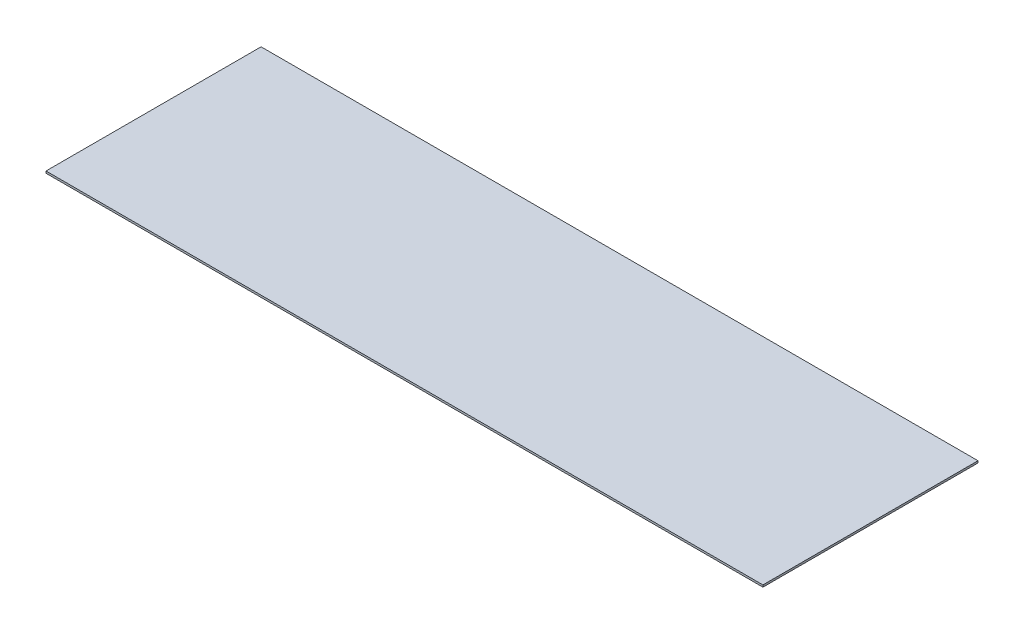
ISO-10303-21;
HEADER;
FILE_DESCRIPTION(('STEP AP214'),'2;1');
FILE_NAME('part.step','',(''),(''),'','','');
FILE_SCHEMA(('AUTOMOTIVE_DESIGN { 1 0 10303 214 1 1 1 1 }'));
ENDSEC;
DATA;
#1=APPLICATION_CONTEXT('core data for automotive mechanical design processes');
#2=APPLICATION_PROTOCOL_DEFINITION('international standard','automotive_design',2000,#1);
#3=PRODUCT_CONTEXT('',#1,'mechanical');
#4=PRODUCT('Part','Part','',(#3));
#5=PRODUCT_RELATED_PRODUCT_CATEGORY('part','',(#4));
#6=PRODUCT_DEFINITION_FORMATION('','',#4);
#7=PRODUCT_DEFINITION_CONTEXT('part definition',#1,'design');
#8=PRODUCT_DEFINITION('design','',#6,#7);
#9=PRODUCT_DEFINITION_SHAPE('','',#8);
#10=(LENGTH_UNIT() NAMED_UNIT(*) SI_UNIT(.MILLI.,.METRE.));
#11=(NAMED_UNIT(*) PLANE_ANGLE_UNIT() SI_UNIT($,.RADIAN.));
#12=(NAMED_UNIT(*) SI_UNIT($,.STERADIAN.) SOLID_ANGLE_UNIT());
#13=UNCERTAINTY_MEASURE_WITH_UNIT(LENGTH_MEASURE(1.E-05),#10,'distance_accuracy_value','');
#14=(GEOMETRIC_REPRESENTATION_CONTEXT(3) GLOBAL_UNCERTAINTY_ASSIGNED_CONTEXT((#13)) GLOBAL_UNIT_ASSIGNED_CONTEXT((#10,
#11,#12)) REPRESENTATION_CONTEXT('',''));
#15=CARTESIAN_POINT('',(0.,0.,0.));
#16=DIRECTION('',(0.,0.,1.));
#17=DIRECTION('',(1.,0.,0.));
#18=AXIS2_PLACEMENT_3D('',#15,#16,#17);
#19=CARTESIAN_POINT('',(900.,5.,270.));
#20=DIRECTION('',(-1.,0.,0.));
#21=DIRECTION('',(0.,0.,1.));
#22=AXIS2_PLACEMENT_3D('',#19,#20,#21);
#23=PLANE('',#22);
#24=DIRECTION('',(0.,0.,-1.));
#25=VECTOR('',#24,1.);
#26=CARTESIAN_POINT('',(900.,0.,270.));
#27=LINE('',#26,#25);
#28=CARTESIAN_POINT('',(900.,0.,270.));
#29=VERTEX_POINT('',#28);
#30=CARTESIAN_POINT('',(900.,0.,-270.));
#31=VERTEX_POINT('',#30);
#32=EDGE_CURVE('E99',#29,#31,#27,.T.);
#33=ORIENTED_EDGE('',*,*,#32,.T.);
#34=DIRECTION('',(0.,-1.,0.));
#35=VECTOR('',#34,1.);
#36=CARTESIAN_POINT('',(900.,5.,-270.));
#37=LINE('',#36,#35);
#38=CARTESIAN_POINT('',(900.,5.,-270.));
#39=VERTEX_POINT('',#38);
#40=EDGE_CURVE('E11',#39,#31,#37,.T.);
#41=ORIENTED_EDGE('',*,*,#40,.F.);
#42=DIRECTION('',(0.,0.,-1.));
#43=VECTOR('',#42,1.);
#44=CARTESIAN_POINT('',(900.,5.,270.));
#45=LINE('',#44,#43);
#46=CARTESIAN_POINT('',(900.,5.,270.));
#47=VERTEX_POINT('',#46);
#48=EDGE_CURVE('E87',#47,#39,#45,.T.);
#49=ORIENTED_EDGE('',*,*,#48,.F.);
#50=DIRECTION('',(0.,-1.,0.));
#51=VECTOR('',#50,1.);
#52=CARTESIAN_POINT('',(900.,5.,270.));
#53=LINE('',#52,#51);
#54=EDGE_CURVE('E95',#47,#29,#53,.T.);
#55=ORIENTED_EDGE('',*,*,#54,.T.);
#56=EDGE_LOOP('',(#33,#41,#49,#55));
#57=FACE_BOUND('',#56,.T.);
#58=ADVANCED_FACE('F36',(#57),#23,.F.);
#59=CARTESIAN_POINT('',(-900.,5.,-270.));
#60=DIRECTION('',(0.,0.,1.));
#61=DIRECTION('',(1.,0.,0.));
#62=AXIS2_PLACEMENT_3D('',#59,#60,#61);
#63=PLANE('',#62);
#64=DIRECTION('',(-1.,0.,0.));
#65=VECTOR('',#64,1.);
#66=CARTESIAN_POINT('',(-900.,0.,-270.));
#67=LINE('',#66,#65);
#68=CARTESIAN_POINT('',(-900.,0.,-270.));
#69=VERTEX_POINT('',#68);
#70=EDGE_CURVE('E91',#31,#69,#67,.T.);
#71=ORIENTED_EDGE('',*,*,#70,.T.);
#72=DIRECTION('',(0.,-1.,0.));
#73=VECTOR('',#72,1.);
#74=CARTESIAN_POINT('',(-900.,5.,-270.));
#75=LINE('',#74,#73);
#76=CARTESIAN_POINT('',(-900.,5.,-270.));
#77=VERTEX_POINT('',#76);
#78=EDGE_CURVE('E44',#77,#69,#75,.T.);
#79=ORIENTED_EDGE('',*,*,#78,.F.);
#80=DIRECTION('',(-1.,0.,0.));
#81=VECTOR('',#80,1.);
#82=CARTESIAN_POINT('',(-900.,5.,-270.));
#83=LINE('',#82,#81);
#84=EDGE_CURVE('E82',#39,#77,#83,.T.);
#85=ORIENTED_EDGE('',*,*,#84,.F.);
#86=ORIENTED_EDGE('',*,*,#40,.T.);
#87=EDGE_LOOP('',(#71,#79,#85,#86));
#88=FACE_BOUND('',#87,.T.);
#89=ADVANCED_FACE('F90',(#88),#63,.F.);
#90=CARTESIAN_POINT('',(-900.,5.,270.));
#91=DIRECTION('',(1.,0.,0.));
#92=DIRECTION('',(0.,0.,-1.));
#93=AXIS2_PLACEMENT_3D('',#90,#91,#92);
#94=PLANE('',#93);
#95=DIRECTION('',(0.,0.,1.));
#96=VECTOR('',#95,1.);
#97=CARTESIAN_POINT('',(-900.,0.,270.));
#98=LINE('',#97,#96);
#99=CARTESIAN_POINT('',(-900.,0.,270.));
#100=VERTEX_POINT('',#99);
#101=EDGE_CURVE('E69',#69,#100,#98,.T.);
#102=ORIENTED_EDGE('',*,*,#101,.T.);
#103=DIRECTION('',(0.,-1.,0.));
#104=VECTOR('',#103,1.);
#105=CARTESIAN_POINT('',(-900.,5.,270.));
#106=LINE('',#105,#104);
#107=CARTESIAN_POINT('',(-900.,5.,270.));
#108=VERTEX_POINT('',#107);
#109=EDGE_CURVE('E92',#108,#100,#106,.T.);
#110=ORIENTED_EDGE('',*,*,#109,.F.);
#111=DIRECTION('',(0.,0.,1.));
#112=VECTOR('',#111,1.);
#113=CARTESIAN_POINT('',(-900.,5.,270.));
#114=LINE('',#113,#112);
#115=EDGE_CURVE('E85',#77,#108,#114,.T.);
#116=ORIENTED_EDGE('',*,*,#115,.F.);
#117=ORIENTED_EDGE('',*,*,#78,.T.);
#118=EDGE_LOOP('',(#102,#110,#116,#117));
#119=FACE_BOUND('',#118,.T.);
#120=ADVANCED_FACE('F93',(#119),#94,.F.);
#121=CARTESIAN_POINT('',(-900.,5.,270.));
#122=DIRECTION('',(0.,0.,-1.));
#123=DIRECTION('',(-1.,0.,0.));
#124=AXIS2_PLACEMENT_3D('',#121,#122,#123);
#125=PLANE('',#124);
#126=DIRECTION('',(1.,0.,0.));
#127=VECTOR('',#126,1.);
#128=CARTESIAN_POINT('',(-900.,0.,270.));
#129=LINE('',#128,#127);
#130=EDGE_CURVE('E75',#100,#29,#129,.T.);
#131=ORIENTED_EDGE('',*,*,#130,.T.);
#132=ORIENTED_EDGE('',*,*,#54,.F.);
#133=DIRECTION('',(1.,0.,0.));
#134=VECTOR('',#133,1.);
#135=CARTESIAN_POINT('',(-900.,5.,270.));
#136=LINE('',#135,#134);
#137=EDGE_CURVE('E52',#108,#47,#136,.T.);
#138=ORIENTED_EDGE('',*,*,#137,.F.);
#139=ORIENTED_EDGE('',*,*,#109,.T.);
#140=EDGE_LOOP('',(#131,#132,#138,#139));
#141=FACE_BOUND('',#140,.T.);
#142=ADVANCED_FACE('F106',(#141),#125,.F.);
#143=CARTESIAN_POINT('',(0.,5.,0.));
#144=DIRECTION('',(0.,-1.,0.));
#145=DIRECTION('',(0.,0.,-1.));
#146=AXIS2_PLACEMENT_3D('',#143,#144,#145);
#147=PLANE('',#146);
#148=ORIENTED_EDGE('',*,*,#48,.T.);
#149=ORIENTED_EDGE('',*,*,#84,.T.);
#150=ORIENTED_EDGE('',*,*,#115,.T.);
#151=ORIENTED_EDGE('',*,*,#137,.T.);
#152=EDGE_LOOP('',(#148,#149,#150,#151));
#153=FACE_BOUND('',#152,.T.);
#154=ADVANCED_FACE('F83',(#153),#147,.F.);
#155=CARTESIAN_POINT('',(0.,0.,0.));
#156=DIRECTION('',(0.,-1.,0.));
#157=DIRECTION('',(0.,0.,-1.));
#158=AXIS2_PLACEMENT_3D('',#155,#156,#157);
#159=PLANE('',#158);
#160=ORIENTED_EDGE('',*,*,#32,.F.);
#161=ORIENTED_EDGE('',*,*,#130,.F.);
#162=ORIENTED_EDGE('',*,*,#101,.F.);
#163=ORIENTED_EDGE('',*,*,#70,.F.);
#164=EDGE_LOOP('',(#160,#161,#162,#163));
#165=FACE_BOUND('',#164,.T.);
#166=ADVANCED_FACE('F109',(#165),#159,.T.);
#167=CLOSED_SHELL('',(#58,#89,#120,#142,#154,#166));
#168=MANIFOLD_SOLID_BREP('B2',#167);
#169=ADVANCED_BREP_SHAPE_REPRESENTATION('',(#18,#168),#14);
#170=SHAPE_DEFINITION_REPRESENTATION(#9,#169);
ENDSEC;
END-ISO-10303-21;
